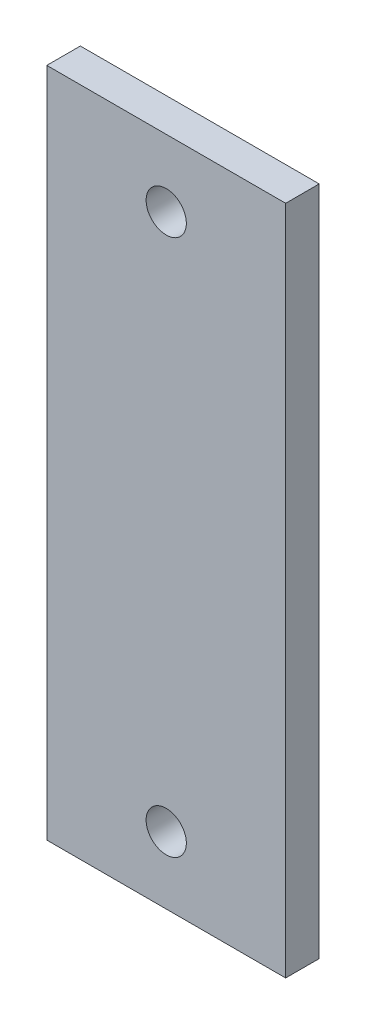
ISO-10303-21;
HEADER;
FILE_DESCRIPTION(('STEP AP214'),'2;1');
FILE_NAME('part.step','',(''),(''),'','','');
FILE_SCHEMA(('AUTOMOTIVE_DESIGN { 1 0 10303 214 1 1 1 1 }'));
ENDSEC;
DATA;
#1=APPLICATION_CONTEXT('core data for automotive mechanical design processes');
#2=APPLICATION_PROTOCOL_DEFINITION('international standard','automotive_design',2000,#1);
#3=PRODUCT_CONTEXT('',#1,'mechanical');
#4=PRODUCT('Part','Part','',(#3));
#5=PRODUCT_RELATED_PRODUCT_CATEGORY('part','',(#4));
#6=PRODUCT_DEFINITION_FORMATION('','',#4);
#7=PRODUCT_DEFINITION_CONTEXT('part definition',#1,'design');
#8=PRODUCT_DEFINITION('design','',#6,#7);
#9=PRODUCT_DEFINITION_SHAPE('','',#8);
#10=(LENGTH_UNIT() NAMED_UNIT(*) SI_UNIT(.MILLI.,.METRE.));
#11=(NAMED_UNIT(*) PLANE_ANGLE_UNIT() SI_UNIT($,.RADIAN.));
#12=(NAMED_UNIT(*) SI_UNIT($,.STERADIAN.) SOLID_ANGLE_UNIT());
#13=UNCERTAINTY_MEASURE_WITH_UNIT(LENGTH_MEASURE(1.E-05),#10,'distance_accuracy_value','');
#14=(GEOMETRIC_REPRESENTATION_CONTEXT(3) GLOBAL_UNCERTAINTY_ASSIGNED_CONTEXT((#13)) GLOBAL_UNIT_ASSIGNED_CONTEXT((#10,
#11,#12)) REPRESENTATION_CONTEXT('',''));
#15=CARTESIAN_POINT('',(0.,0.,0.));
#16=DIRECTION('',(0.,0.,1.));
#17=DIRECTION('',(1.,0.,0.));
#18=AXIS2_PLACEMENT_3D('',#15,#16,#17);
#19=CARTESIAN_POINT('',(0.,0.,2.5));
#20=DIRECTION('',(0.,0.,-1.));
#21=DIRECTION('',(-1.,0.,0.));
#22=AXIS2_PLACEMENT_3D('',#19,#20,#21);
#23=PLANE('',#22);
#24=DIRECTION('',(0.,1.,0.));
#25=VECTOR('',#24,1.);
#26=CARTESIAN_POINT('',(8.9,-25.,2.5));
#27=LINE('',#26,#25);
#28=CARTESIAN_POINT('',(8.9,-25.,2.5));
#29=VERTEX_POINT('',#28);
#30=CARTESIAN_POINT('',(8.9,25.,2.5));
#31=VERTEX_POINT('',#30);
#32=EDGE_CURVE('E98',#29,#31,#27,.T.);
#33=ORIENTED_EDGE('',*,*,#32,.T.);
#34=DIRECTION('',(-1.,0.,0.));
#35=VECTOR('',#34,1.);
#36=CARTESIAN_POINT('',(-8.9,25.,2.5));
#37=LINE('',#36,#35);
#38=CARTESIAN_POINT('',(-8.9,25.,2.5));
#39=VERTEX_POINT('',#38);
#40=EDGE_CURVE('E93',#31,#39,#37,.T.);
#41=ORIENTED_EDGE('',*,*,#40,.T.);
#42=DIRECTION('',(0.,-1.,0.));
#43=VECTOR('',#42,1.);
#44=CARTESIAN_POINT('',(-8.9,-25.,2.5));
#45=LINE('',#44,#43);
#46=CARTESIAN_POINT('',(-8.9,-25.,2.5));
#47=VERTEX_POINT('',#46);
#48=EDGE_CURVE('E96',#39,#47,#45,.T.);
#49=ORIENTED_EDGE('',*,*,#48,.T.);
#50=DIRECTION('',(1.,0.,0.));
#51=VECTOR('',#50,1.);
#52=CARTESIAN_POINT('',(-8.9,-25.,2.5));
#53=LINE('',#52,#51);
#54=EDGE_CURVE('E63',#47,#29,#53,.T.);
#55=ORIENTED_EDGE('',*,*,#54,.T.);
#56=EDGE_LOOP('',(#33,#41,#49,#55));
#57=FACE_BOUND('',#56,.T.);
#58=CARTESIAN_POINT('',(0.,-20.,2.5));
#59=DIRECTION('',(0.,0.,1.));
#60=DIRECTION('',(1.,0.,0.));
#61=AXIS2_PLACEMENT_3D('',#58,#59,#60);
#62=CIRCLE('',#61,1.5);
#63=CARTESIAN_POINT('',(1.5,-20.,2.5));
#64=VERTEX_POINT('',#63);
#65=EDGE_CURVE('E118',#64,#64,#62,.T.);
#66=ORIENTED_EDGE('',*,*,#65,.F.);
#67=EDGE_LOOP('',(#66));
#68=FACE_BOUND('',#67,.T.);
#69=CARTESIAN_POINT('',(0.,20.,2.5));
#70=DIRECTION('',(0.,0.,1.));
#71=DIRECTION('',(1.,0.,0.));
#72=AXIS2_PLACEMENT_3D('',#69,#70,#71);
#73=CIRCLE('',#72,1.5);
#74=CARTESIAN_POINT('',(1.5,20.,2.5));
#75=VERTEX_POINT('',#74);
#76=EDGE_CURVE('E140',#75,#75,#73,.T.);
#77=ORIENTED_EDGE('',*,*,#76,.F.);
#78=EDGE_LOOP('',(#77));
#79=FACE_BOUND('',#78,.T.);
#80=ADVANCED_FACE('F45',(#57,#68,#79),#23,.F.);
#81=CARTESIAN_POINT('',(0.,0.,0.));
#82=DIRECTION('',(0.,0.,-1.));
#83=DIRECTION('',(-1.,0.,0.));
#84=AXIS2_PLACEMENT_3D('',#81,#82,#83);
#85=PLANE('',#84);
#86=CARTESIAN_POINT('',(0.,-20.,0.));
#87=DIRECTION('',(0.,0.,1.));
#88=DIRECTION('',(1.,0.,0.));
#89=AXIS2_PLACEMENT_3D('',#86,#87,#88);
#90=CIRCLE('',#89,1.5);
#91=CARTESIAN_POINT('',(1.5,-20.,0.));
#92=VERTEX_POINT('',#91);
#93=EDGE_CURVE('E136',#92,#92,#90,.T.);
#94=ORIENTED_EDGE('',*,*,#93,.T.);
#95=EDGE_LOOP('',(#94));
#96=FACE_BOUND('',#95,.T.);
#97=DIRECTION('',(0.,1.,0.));
#98=VECTOR('',#97,1.);
#99=CARTESIAN_POINT('',(8.9,-25.,0.));
#100=LINE('',#99,#98);
#101=CARTESIAN_POINT('',(8.9,-25.,0.));
#102=VERTEX_POINT('',#101);
#103=CARTESIAN_POINT('',(8.9,25.,0.));
#104=VERTEX_POINT('',#103);
#105=EDGE_CURVE('E114',#102,#104,#100,.T.);
#106=ORIENTED_EDGE('',*,*,#105,.F.);
#107=DIRECTION('',(1.,0.,0.));
#108=VECTOR('',#107,1.);
#109=CARTESIAN_POINT('',(-8.9,-25.,0.));
#110=LINE('',#109,#108);
#111=CARTESIAN_POINT('',(-8.9,-25.,0.));
#112=VERTEX_POINT('',#111);
#113=EDGE_CURVE('E86',#112,#102,#110,.T.);
#114=ORIENTED_EDGE('',*,*,#113,.F.);
#115=DIRECTION('',(0.,-1.,0.));
#116=VECTOR('',#115,1.);
#117=CARTESIAN_POINT('',(-8.9,-25.,0.));
#118=LINE('',#117,#116);
#119=CARTESIAN_POINT('',(-8.9,25.,0.));
#120=VERTEX_POINT('',#119);
#121=EDGE_CURVE('E80',#120,#112,#118,.T.);
#122=ORIENTED_EDGE('',*,*,#121,.F.);
#123=DIRECTION('',(-1.,0.,0.));
#124=VECTOR('',#123,1.);
#125=CARTESIAN_POINT('',(-8.9,25.,0.));
#126=LINE('',#125,#124);
#127=EDGE_CURVE('E103',#104,#120,#126,.T.);
#128=ORIENTED_EDGE('',*,*,#127,.F.);
#129=EDGE_LOOP('',(#106,#114,#122,#128));
#130=FACE_BOUND('',#129,.T.);
#131=CARTESIAN_POINT('',(0.,20.,0.));
#132=DIRECTION('',(0.,0.,1.));
#133=DIRECTION('',(1.,0.,0.));
#134=AXIS2_PLACEMENT_3D('',#131,#132,#133);
#135=CIRCLE('',#134,1.5);
#136=CARTESIAN_POINT('',(1.5,20.,0.));
#137=VERTEX_POINT('',#136);
#138=EDGE_CURVE('E144',#137,#137,#135,.T.);
#139=ORIENTED_EDGE('',*,*,#138,.T.);
#140=EDGE_LOOP('',(#139));
#141=FACE_BOUND('',#140,.T.);
#142=ADVANCED_FACE('F131',(#96,#130,#141),#85,.T.);
#143=CARTESIAN_POINT('',(8.9,-25.,2.5));
#144=DIRECTION('',(-1.,0.,0.));
#145=DIRECTION('',(0.,0.,1.));
#146=AXIS2_PLACEMENT_3D('',#143,#144,#145);
#147=PLANE('',#146);
#148=ORIENTED_EDGE('',*,*,#105,.T.);
#149=DIRECTION('',(0.,0.,-1.));
#150=VECTOR('',#149,1.);
#151=CARTESIAN_POINT('',(8.9,25.,2.5));
#152=LINE('',#151,#150);
#153=EDGE_CURVE('E11',#31,#104,#152,.T.);
#154=ORIENTED_EDGE('',*,*,#153,.F.);
#155=ORIENTED_EDGE('',*,*,#32,.F.);
#156=DIRECTION('',(0.,0.,-1.));
#157=VECTOR('',#156,1.);
#158=CARTESIAN_POINT('',(8.9,-25.,2.5));
#159=LINE('',#158,#157);
#160=EDGE_CURVE('E110',#29,#102,#159,.T.);
#161=ORIENTED_EDGE('',*,*,#160,.T.);
#162=EDGE_LOOP('',(#148,#154,#155,#161));
#163=FACE_BOUND('',#162,.T.);
#164=ADVANCED_FACE('F47',(#163),#147,.F.);
#165=CARTESIAN_POINT('',(-8.9,25.,2.5));
#166=DIRECTION('',(0.,-1.,0.));
#167=DIRECTION('',(0.,0.,-1.));
#168=AXIS2_PLACEMENT_3D('',#165,#166,#167);
#169=PLANE('',#168);
#170=ORIENTED_EDGE('',*,*,#127,.T.);
#171=DIRECTION('',(0.,0.,-1.));
#172=VECTOR('',#171,1.);
#173=CARTESIAN_POINT('',(-8.9,25.,2.5));
#174=LINE('',#173,#172);
#175=EDGE_CURVE('E55',#39,#120,#174,.T.);
#176=ORIENTED_EDGE('',*,*,#175,.F.);
#177=ORIENTED_EDGE('',*,*,#40,.F.);
#178=ORIENTED_EDGE('',*,*,#153,.T.);
#179=EDGE_LOOP('',(#170,#176,#177,#178));
#180=FACE_BOUND('',#179,.T.);
#181=ADVANCED_FACE('F102',(#180),#169,.F.);
#182=CARTESIAN_POINT('',(-8.9,-25.,2.5));
#183=DIRECTION('',(1.,0.,0.));
#184=DIRECTION('',(0.,0.,-1.));
#185=AXIS2_PLACEMENT_3D('',#182,#183,#184);
#186=PLANE('',#185);
#187=ORIENTED_EDGE('',*,*,#121,.T.);
#188=DIRECTION('',(0.,0.,-1.));
#189=VECTOR('',#188,1.);
#190=CARTESIAN_POINT('',(-8.9,-25.,2.5));
#191=LINE('',#190,#189);
#192=EDGE_CURVE('E105',#47,#112,#191,.T.);
#193=ORIENTED_EDGE('',*,*,#192,.F.);
#194=ORIENTED_EDGE('',*,*,#48,.F.);
#195=ORIENTED_EDGE('',*,*,#175,.T.);
#196=EDGE_LOOP('',(#187,#193,#194,#195));
#197=FACE_BOUND('',#196,.T.);
#198=ADVANCED_FACE('F106',(#197),#186,.F.);
#199=CARTESIAN_POINT('',(-8.9,-25.,2.5));
#200=DIRECTION('',(0.,1.,0.));
#201=DIRECTION('',(0.,0.,1.));
#202=AXIS2_PLACEMENT_3D('',#199,#200,#201);
#203=PLANE('',#202);
#204=ORIENTED_EDGE('',*,*,#113,.T.);
#205=ORIENTED_EDGE('',*,*,#160,.F.);
#206=ORIENTED_EDGE('',*,*,#54,.F.);
#207=ORIENTED_EDGE('',*,*,#192,.T.);
#208=EDGE_LOOP('',(#204,#205,#206,#207));
#209=FACE_BOUND('',#208,.T.);
#210=ADVANCED_FACE('F128',(#209),#203,.F.);
#211=CARTESIAN_POINT('',(0.,-20.,2.5));
#212=DIRECTION('',(0.,0.,-1.));
#213=DIRECTION('',(-1.,0.,0.));
#214=AXIS2_PLACEMENT_3D('',#211,#212,#213);
#215=CYLINDRICAL_SURFACE('',#214,1.5);
#216=ORIENTED_EDGE('',*,*,#65,.T.);
#217=EDGE_LOOP('',(#216));
#218=FACE_BOUND('',#217,.T.);
#219=ORIENTED_EDGE('',*,*,#93,.F.);
#220=EDGE_LOOP('',(#219));
#221=FACE_BOUND('',#220,.T.);
#222=ADVANCED_FACE('F163',(#218,#221),#215,.F.);
#223=CARTESIAN_POINT('',(0.,20.,2.5));
#224=DIRECTION('',(0.,0.,-1.));
#225=DIRECTION('',(-1.,0.,0.));
#226=AXIS2_PLACEMENT_3D('',#223,#224,#225);
#227=CYLINDRICAL_SURFACE('',#226,1.5);
#228=ORIENTED_EDGE('',*,*,#76,.T.);
#229=EDGE_LOOP('',(#228));
#230=FACE_BOUND('',#229,.T.);
#231=ORIENTED_EDGE('',*,*,#138,.F.);
#232=EDGE_LOOP('',(#231));
#233=FACE_BOUND('',#232,.T.);
#234=ADVANCED_FACE('F152',(#230,#233),#227,.F.);
#235=CLOSED_SHELL('',(#80,#142,#164,#181,#198,#210,#222,#234));
#236=MANIFOLD_SOLID_BREP('B2',#235);
#237=ADVANCED_BREP_SHAPE_REPRESENTATION('',(#18,#236),#14);
#238=SHAPE_DEFINITION_REPRESENTATION(#9,#237);
ENDSEC;
END-ISO-10303-21;
